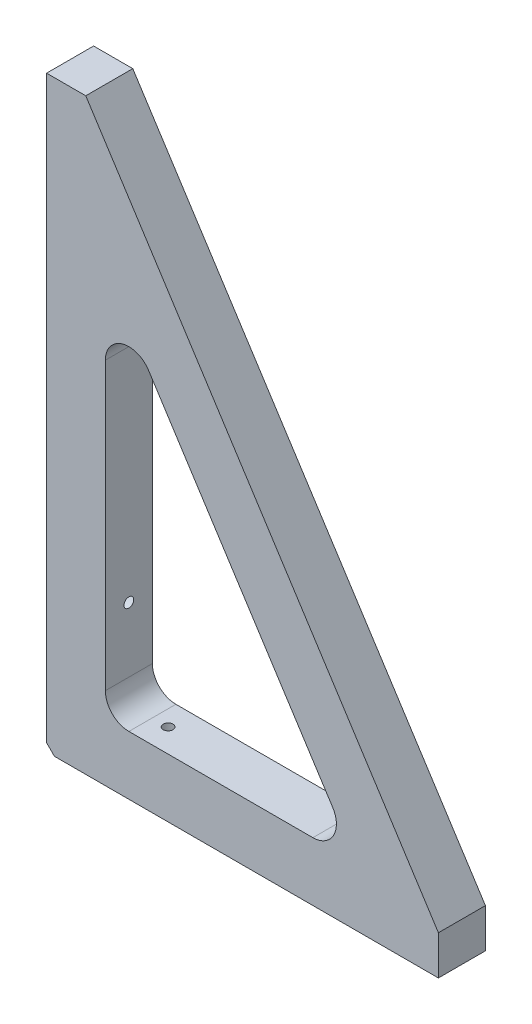
ISO-10303-21;
HEADER;
FILE_DESCRIPTION(('STEP AP214'),'2;1');
FILE_NAME('part.step','',(''),(''),'','','');
FILE_SCHEMA(('AUTOMOTIVE_DESIGN { 1 0 10303 214 1 1 1 1 }'));
ENDSEC;
DATA;
#1=APPLICATION_CONTEXT('core data for automotive mechanical design processes');
#2=APPLICATION_PROTOCOL_DEFINITION('international standard','automotive_design',2000,#1);
#3=PRODUCT_CONTEXT('',#1,'mechanical');
#4=PRODUCT('Part','Part','',(#3));
#5=PRODUCT_RELATED_PRODUCT_CATEGORY('part','',(#4));
#6=PRODUCT_DEFINITION_FORMATION('','',#4);
#7=PRODUCT_DEFINITION_CONTEXT('part definition',#1,'design');
#8=PRODUCT_DEFINITION('design','',#6,#7);
#9=PRODUCT_DEFINITION_SHAPE('','',#8);
#10=(LENGTH_UNIT() NAMED_UNIT(*) SI_UNIT(.MILLI.,.METRE.));
#11=(NAMED_UNIT(*) PLANE_ANGLE_UNIT() SI_UNIT($,.RADIAN.));
#12=(NAMED_UNIT(*) SI_UNIT($,.STERADIAN.) SOLID_ANGLE_UNIT());
#13=UNCERTAINTY_MEASURE_WITH_UNIT(LENGTH_MEASURE(1.E-05),#10,'distance_accuracy_value','');
#14=(GEOMETRIC_REPRESENTATION_CONTEXT(3) GLOBAL_UNCERTAINTY_ASSIGNED_CONTEXT((#13)) GLOBAL_UNIT_ASSIGNED_CONTEXT((#10,
#11,#12)) REPRESENTATION_CONTEXT('',''));
#15=CARTESIAN_POINT('',(0.,0.,0.));
#16=DIRECTION('',(0.,0.,1.));
#17=DIRECTION('',(1.,0.,0.));
#18=AXIS2_PLACEMENT_3D('',#15,#16,#17);
#19=CARTESIAN_POINT('',(13.8000000000034,112.5,0.));
#20=DIRECTION('',(-1.,0.,0.));
#21=DIRECTION('',(0.,0.,1.));
#22=AXIS2_PLACEMENT_3D('',#19,#20,#21);
#23=CONICAL_SURFACE('',#22,3.3235000000218,1.0471975511963);
#24=CARTESIAN_POINT('',(13.8,112.5,0.));
#25=DIRECTION('',(-1.,0.,0.));
#26=DIRECTION('',(0.,0.,1.));
#27=AXIS2_PLACEMENT_3D('',#24,#25,#26);
#28=CIRCLE('',#27,3.32349999999999);
#29=CARTESIAN_POINT('',(13.8,112.5,3.32349999999999));
#30=VERTEX_POINT('',#29);
#31=EDGE_CURVE('E215',#30,#30,#28,.T.);
#32=ORIENTED_EDGE('',*,*,#31,.T.);
#33=EDGE_LOOP('',(#32));
#34=FACE_BOUND('',#33,.T.);
#35=CARTESIAN_POINT('',(15.7188236196362,112.5,0.));
#36=VERTEX_POINT('',#35);
#37=VERTEX_LOOP('',#36);
#38=FACE_BOUND('',#37,.T.);
#39=ADVANCED_FACE('F17',(#34,#38),#23,.F.);
#40=CARTESIAN_POINT('',(75.,13.8000000000034,0.));
#41=DIRECTION('',(0.,-1.,0.));
#42=DIRECTION('',(0.,0.,-1.));
#43=AXIS2_PLACEMENT_3D('',#40,#41,#42);
#44=CONICAL_SURFACE('',#43,3.3235000000218,1.0471975511963);
#45=CARTESIAN_POINT('',(75.,13.7999999999992,0.));
#46=DIRECTION('',(0.,1.,0.));
#47=DIRECTION('',(0.,0.,1.));
#48=AXIS2_PLACEMENT_3D('',#45,#46,#47);
#49=CIRCLE('',#48,3.32350000000001);
#50=CARTESIAN_POINT('',(75.,13.7999999999992,3.32350000000001));
#51=VERTEX_POINT('',#50);
#52=EDGE_CURVE('E233',#51,#51,#49,.F.);
#53=ORIENTED_EDGE('',*,*,#52,.T.);
#54=EDGE_LOOP('',(#53));
#55=FACE_BOUND('',#54,.T.);
#56=CARTESIAN_POINT('',(75.,15.7188236196362,0.));
#57=VERTEX_POINT('',#56);
#58=VERTEX_LOOP('',#57);
#59=FACE_BOUND('',#58,.T.);
#60=ADVANCED_FACE('F108',(#55,#59),#44,.F.);
#61=CARTESIAN_POINT('',(15.7188236196517,112.5,0.));
#62=DIRECTION('',(-1.,0.,0.));
#63=DIRECTION('',(0.,0.,1.));
#64=AXIS2_PLACEMENT_3D('',#61,#62,#63);
#65=CYLINDRICAL_SURFACE('',#64,3.32349999999999);
#66=ORIENTED_EDGE('',*,*,#31,.F.);
#67=EDGE_LOOP('',(#66));
#68=FACE_BOUND('',#67,.T.);
#69=CARTESIAN_POINT('',(0.676499999997304,112.5,0.));
#70=DIRECTION('',(-1.,0.,0.));
#71=DIRECTION('',(0.,0.,1.));
#72=AXIS2_PLACEMENT_3D('',#69,#70,#71);
#73=CIRCLE('',#72,3.3235000000218);
#74=CARTESIAN_POINT('',(0.676499999997304,112.5,3.3235000000218));
#75=VERTEX_POINT('',#74);
#76=EDGE_CURVE('E218',#75,#75,#73,.T.);
#77=ORIENTED_EDGE('',*,*,#76,.T.);
#78=EDGE_LOOP('',(#77));
#79=FACE_BOUND('',#78,.T.);
#80=ADVANCED_FACE('F113',(#68,#79),#65,.F.);
#81=CARTESIAN_POINT('',(75.,0.,0.));
#82=DIRECTION('',(0.,1.,0.));
#83=DIRECTION('',(0.,0.,1.));
#84=AXIS2_PLACEMENT_3D('',#81,#82,#83);
#85=CYLINDRICAL_SURFACE('',#84,3.32350000000001);
#86=ORIENTED_EDGE('',*,*,#52,.F.);
#87=EDGE_LOOP('',(#86));
#88=FACE_BOUND('',#87,.T.);
#89=CARTESIAN_POINT('',(75.,0.676499999940461,0.));
#90=DIRECTION('',(0.,-1.,0.));
#91=DIRECTION('',(0.,0.,-1.));
#92=AXIS2_PLACEMENT_3D('',#89,#90,#91);
#93=CIRCLE('',#92,3.3235000000218);
#94=CARTESIAN_POINT('',(75.,0.676499999940461,-3.3235000000218));
#95=VERTEX_POINT('',#94);
#96=EDGE_CURVE('E229',#95,#95,#93,.T.);
#97=ORIENTED_EDGE('',*,*,#96,.T.);
#98=EDGE_LOOP('',(#97));
#99=FACE_BOUND('',#98,.T.);
#100=ADVANCED_FACE('F205',(#88,#99),#85,.F.);
#101=CARTESIAN_POINT('',(25.,0.,0.));
#102=DIRECTION('',(0.,1.,0.));
#103=DIRECTION('',(0.,0.,1.));
#104=AXIS2_PLACEMENT_3D('',#101,#102,#103);
#105=CYLINDRICAL_SURFACE('',#104,3.3235);
#106=CARTESIAN_POINT('',(25.,0.676499999997304,0.));
#107=DIRECTION('',(0.,-1.,0.));
#108=DIRECTION('',(0.,0.,-1.));
#109=AXIS2_PLACEMENT_3D('',#106,#107,#108);
#110=CIRCLE('',#109,3.3235000000218);
#111=CARTESIAN_POINT('',(25.,0.676499999997304,-3.3235000000218));
#112=VERTEX_POINT('',#111);
#113=EDGE_CURVE('E221',#112,#112,#110,.T.);
#114=ORIENTED_EDGE('',*,*,#113,.T.);
#115=EDGE_LOOP('',(#114));
#116=FACE_BOUND('',#115,.T.);
#117=CARTESIAN_POINT('',(25.,13.8000000000034,0.));
#118=DIRECTION('',(0.,-1.,0.));
#119=DIRECTION('',(0.,0.,-1.));
#120=AXIS2_PLACEMENT_3D('',#117,#118,#119);
#121=CIRCLE('',#120,3.3235000000218);
#122=CARTESIAN_POINT('',(25.,13.8000000000034,-3.3235000000218));
#123=VERTEX_POINT('',#122);
#124=EDGE_CURVE('E308',#123,#123,#121,.F.);
#125=ORIENTED_EDGE('',*,*,#124,.T.);
#126=EDGE_LOOP('',(#125));
#127=FACE_BOUND('',#126,.T.);
#128=ADVANCED_FACE('F201',(#116,#127),#105,.F.);
#129=CARTESIAN_POINT('',(15.7188236196517,37.5,0.));
#130=DIRECTION('',(-1.,0.,0.));
#131=DIRECTION('',(0.,0.,1.));
#132=AXIS2_PLACEMENT_3D('',#129,#130,#131);
#133=CYLINDRICAL_SURFACE('',#132,3.32350000000001);
#134=CARTESIAN_POINT('',(0.676499999940461,37.5,0.));
#135=DIRECTION('',(-1.,0.,0.));
#136=DIRECTION('',(0.,0.,1.));
#137=AXIS2_PLACEMENT_3D('',#134,#135,#136);
#138=CIRCLE('',#137,3.3235000000218);
#139=CARTESIAN_POINT('',(0.676499999940461,37.5,3.3235000000218));
#140=VERTEX_POINT('',#139);
#141=EDGE_CURVE('E222',#140,#140,#138,.T.);
#142=ORIENTED_EDGE('',*,*,#141,.T.);
#143=EDGE_LOOP('',(#142));
#144=FACE_BOUND('',#143,.T.);
#145=CARTESIAN_POINT('',(13.8000000000034,37.5,0.));
#146=DIRECTION('',(-1.,0.,0.));
#147=DIRECTION('',(0.,0.,1.));
#148=AXIS2_PLACEMENT_3D('',#145,#146,#147);
#149=CIRCLE('',#148,3.3235000000218);
#150=CARTESIAN_POINT('',(13.8000000000034,37.5,3.3235000000218));
#151=VERTEX_POINT('',#150);
#152=EDGE_CURVE('E300',#151,#151,#149,.F.);
#153=ORIENTED_EDGE('',*,*,#152,.T.);
#154=EDGE_LOOP('',(#153));
#155=FACE_BOUND('',#154,.T.);
#156=ADVANCED_FACE('F197',(#144,#155),#133,.F.);
#157=CARTESIAN_POINT('',(0.,37.5,0.));
#158=DIRECTION('',(-1.,0.,0.));
#159=DIRECTION('',(0.,0.,1.));
#160=AXIS2_PLACEMENT_3D('',#157,#158,#159);
#161=CONICAL_SURFACE('',#160,3.99999999996226,0.785398163397448);
#162=ORIENTED_EDGE('',*,*,#141,.F.);
#163=EDGE_LOOP('',(#162));
#164=FACE_BOUND('',#163,.T.);
#165=CARTESIAN_POINT('',(0.,37.5,0.));
#166=DIRECTION('',(-1.,0.,0.));
#167=DIRECTION('',(0.,0.,1.));
#168=AXIS2_PLACEMENT_3D('',#165,#166,#167);
#169=CIRCLE('',#168,3.99999999996226);
#170=CARTESIAN_POINT('',(0.,37.5,3.99999999996226));
#171=VERTEX_POINT('',#170);
#172=EDGE_CURVE('E20',#171,#171,#169,.T.);
#173=ORIENTED_EDGE('',*,*,#172,.T.);
#174=EDGE_LOOP('',(#173));
#175=FACE_BOUND('',#174,.T.);
#176=ADVANCED_FACE('F193',(#164,#175),#161,.F.);
#177=CARTESIAN_POINT('',(0.,112.5,0.));
#178=DIRECTION('',(-1.,0.,0.));
#179=DIRECTION('',(0.,0.,1.));
#180=AXIS2_PLACEMENT_3D('',#177,#178,#179);
#181=CONICAL_SURFACE('',#180,3.99999999996226,0.785398163355435);
#182=CARTESIAN_POINT('',(0.,112.5,0.));
#183=DIRECTION('',(-1.,0.,0.));
#184=DIRECTION('',(0.,0.,1.));
#185=AXIS2_PLACEMENT_3D('',#182,#183,#184);
#186=CIRCLE('',#185,3.99999999996226);
#187=CARTESIAN_POINT('',(0.,112.5,3.99999999996226));
#188=VERTEX_POINT('',#187);
#189=EDGE_CURVE('E285',#188,#188,#186,.T.);
#190=ORIENTED_EDGE('',*,*,#189,.T.);
#191=EDGE_LOOP('',(#190));
#192=FACE_BOUND('',#191,.T.);
#193=ORIENTED_EDGE('',*,*,#76,.F.);
#194=EDGE_LOOP('',(#193));
#195=FACE_BOUND('',#194,.T.);
#196=ADVANCED_FACE('F189',(#192,#195),#181,.F.);
#197=CARTESIAN_POINT('',(25.,-5.6843418860808E-11,0.));
#198=DIRECTION('',(0.,-1.,0.));
#199=DIRECTION('',(0.,0.,-1.));
#200=AXIS2_PLACEMENT_3D('',#197,#198,#199);
#201=CONICAL_SURFACE('',#200,4.00000000007594,0.785398163397448);
#202=ORIENTED_EDGE('',*,*,#113,.F.);
#203=EDGE_LOOP('',(#202));
#204=FACE_BOUND('',#203,.T.);
#205=CARTESIAN_POINT('',(25.,0.,0.));
#206=DIRECTION('',(0.,-1.,0.));
#207=DIRECTION('',(0.,0.,-1.));
#208=AXIS2_PLACEMENT_3D('',#205,#206,#207);
#209=CIRCLE('',#208,4.0000000000191);
#210=CARTESIAN_POINT('',(25.,0.,-4.0000000000191));
#211=VERTEX_POINT('',#210);
#212=EDGE_CURVE('E281',#211,#211,#209,.T.);
#213=ORIENTED_EDGE('',*,*,#212,.T.);
#214=EDGE_LOOP('',(#213));
#215=FACE_BOUND('',#214,.T.);
#216=ADVANCED_FACE('F185',(#204,#215),#201,.F.);
#217=CARTESIAN_POINT('',(75.,1.70530256582424E-10,0.));
#218=DIRECTION('',(0.,-1.,0.));
#219=DIRECTION('',(0.,0.,-1.));
#220=AXIS2_PLACEMENT_3D('',#217,#218,#219);
#221=CONICAL_SURFACE('',#220,3.99999999984857,0.785398163439461);
#222=CARTESIAN_POINT('',(75.,5.68434188703607E-11,0.));
#223=DIRECTION('',(0.,-1.,0.));
#224=DIRECTION('',(0.,0.,-1.));
#225=AXIS2_PLACEMENT_3D('',#222,#223,#224);
#226=CIRCLE('',#225,3.99999999996226);
#227=CARTESIAN_POINT('',(75.,5.68434188703607E-11,-3.99999999996226));
#228=VERTEX_POINT('',#227);
#229=EDGE_CURVE('E276',#228,#228,#226,.T.);
#230=ORIENTED_EDGE('',*,*,#229,.T.);
#231=EDGE_LOOP('',(#230));
#232=FACE_BOUND('',#231,.T.);
#233=ORIENTED_EDGE('',*,*,#96,.F.);
#234=EDGE_LOOP('',(#233));
#235=FACE_BOUND('',#234,.T.);
#236=ADVANCED_FACE('F181',(#232,#235),#221,.F.);
#237=CARTESIAN_POINT('',(25.,13.8000000001171,0.));
#238=DIRECTION('',(0.,-1.,0.));
#239=DIRECTION('',(0.,0.,-1.));
#240=AXIS2_PLACEMENT_3D('',#237,#238,#239);
#241=CONICAL_SURFACE('',#240,3.32349999985126,1.04719755120402);
#242=ORIENTED_EDGE('',*,*,#124,.F.);
#243=EDGE_LOOP('',(#242));
#244=FACE_BOUND('',#243,.T.);
#245=CARTESIAN_POINT('',(25.,15.0000000000256,0.));
#246=DIRECTION('',(0.,-1.,0.));
#247=DIRECTION('',(0.,0.,-1.));
#248=AXIS2_PLACEMENT_3D('',#245,#246,#247);
#249=CIRCLE('',#248,1.24503903089135);
#250=CARTESIAN_POINT('',(25.,15.0000000000256,-1.24503903089135));
#251=VERTEX_POINT('',#250);
#252=EDGE_CURVE('E266',#251,#251,#249,.T.);
#253=ORIENTED_EDGE('',*,*,#252,.F.);
#254=EDGE_LOOP('',(#253));
#255=FACE_BOUND('',#254,.T.);
#256=ADVANCED_FACE('F177',(#244,#255),#241,.F.);
#257=CARTESIAN_POINT('',(13.8000000000034,37.5,0.));
#258=DIRECTION('',(-1.,0.,0.));
#259=DIRECTION('',(0.,0.,1.));
#260=AXIS2_PLACEMENT_3D('',#257,#258,#259);
#261=CONICAL_SURFACE('',#260,3.3235000000218,1.04719755120085);
#262=ORIENTED_EDGE('',*,*,#152,.F.);
#263=EDGE_LOOP('',(#262));
#264=FACE_BOUND('',#263,.T.);
#265=CARTESIAN_POINT('',(14.9999999999864,37.5,0.));
#266=DIRECTION('',(-1.,0.,0.));
#267=DIRECTION('',(0.,0.,1.));
#268=AXIS2_PLACEMENT_3D('',#265,#266,#267);
#269=CIRCLE('',#268,1.24503903094819);
#270=CARTESIAN_POINT('',(14.9999999999864,37.5,1.24503903094819));
#271=VERTEX_POINT('',#270);
#272=EDGE_CURVE('E255',#271,#271,#269,.T.);
#273=ORIENTED_EDGE('',*,*,#272,.F.);
#274=EDGE_LOOP('',(#273));
#275=FACE_BOUND('',#274,.T.);
#276=ADVANCED_FACE('F174',(#264,#275),#261,.F.);
#277=CARTESIAN_POINT('',(0.,0.,6.));
#278=DIRECTION('',(0.,0.,1.));
#279=DIRECTION('',(1.,0.,0.));
#280=AXIS2_PLACEMENT_3D('',#277,#278,#279);
#281=PLANE('',#280);
#282=CARTESIAN_POINT('',(21.,21.,6.));
#283=DIRECTION('',(0.,0.,1.));
#284=DIRECTION('',(1.,0.,0.));
#285=AXIS2_PLACEMENT_3D('',#282,#283,#284);
#286=CIRCLE('',#285,6.);
#287=CARTESIAN_POINT('',(21.,15.,6.));
#288=VERTEX_POINT('',#287);
#289=CARTESIAN_POINT('',(15.,21.,6.));
#290=VERTEX_POINT('',#289);
#291=EDGE_CURVE('E260',#288,#290,#286,.F.);
#292=ORIENTED_EDGE('',*,*,#291,.T.);
#293=DIRECTION('',(0.,1.,0.));
#294=VECTOR('',#293,1.);
#295=CARTESIAN_POINT('',(15.,94.0544826090047,6.));
#296=LINE('',#295,#294);
#297=CARTESIAN_POINT('',(15.,94.0544826090047,6.));
#298=VERTEX_POINT('',#297);
#299=EDGE_CURVE('E264',#298,#290,#296,.F.);
#300=ORIENTED_EDGE('',*,*,#299,.F.);
#301=CARTESIAN_POINT('',(21.,94.0544826090047,6.));
#302=DIRECTION('',(0.,0.,1.));
#303=DIRECTION('',(1.,0.,0.));
#304=AXIS2_PLACEMENT_3D('',#301,#302,#303);
#305=CIRCLE('',#304,6.);
#306=CARTESIAN_POINT('',(26.0470708522593,97.2990281568857,6.));
#307=VERTEX_POINT('',#306);
#308=EDGE_CURVE('E252',#298,#307,#305,.F.);
#309=ORIENTED_EDGE('',*,*,#308,.T.);
#310=DIRECTION('',(0.540757591313499,-0.841178475376554,0.));
#311=VECTOR('',#310,1.);
#312=CARTESIAN_POINT('',(73.0106668151909,24.244545547881,6.));
#313=LINE('',#312,#311);
#314=CARTESIAN_POINT('',(73.0106668151909,24.244545547881,6.));
#315=VERTEX_POINT('',#314);
#316=EDGE_CURVE('E74',#315,#307,#313,.F.);
#317=ORIENTED_EDGE('',*,*,#316,.F.);
#318=CARTESIAN_POINT('',(67.9635959629316,21.,6.));
#319=DIRECTION('',(0.,0.,1.));
#320=DIRECTION('',(1.,0.,0.));
#321=AXIS2_PLACEMENT_3D('',#318,#319,#320);
#322=CIRCLE('',#321,6.);
#323=CARTESIAN_POINT('',(67.9635959629316,15.,6.));
#324=VERTEX_POINT('',#323);
#325=EDGE_CURVE('E271',#315,#324,#322,.F.);
#326=ORIENTED_EDGE('',*,*,#325,.T.);
#327=DIRECTION('',(1.,0.,0.));
#328=VECTOR('',#327,1.);
#329=CARTESIAN_POINT('',(21.,15.,6.));
#330=LINE('',#329,#328);
#331=EDGE_CURVE('E274',#288,#324,#330,.T.);
#332=ORIENTED_EDGE('',*,*,#331,.F.);
#333=EDGE_LOOP('',(#292,#300,#309,#317,#326,#332));
#334=FACE_BOUND('',#333,.T.);
#335=DIRECTION('',(0.,1.,0.));
#336=VECTOR('',#335,1.);
#337=CARTESIAN_POINT('',(100.,0.,6.));
#338=LINE('',#337,#336);
#339=CARTESIAN_POINT('',(100.,0.,6.));
#340=VERTEX_POINT('',#339);
#341=CARTESIAN_POINT('',(100.,10.,6.));
#342=VERTEX_POINT('',#341);
#343=EDGE_CURVE('E386',#340,#342,#338,.T.);
#344=ORIENTED_EDGE('',*,*,#343,.T.);
#345=DIRECTION('',(0.540757591313499,-0.841178475376554,0.));
#346=VECTOR('',#345,1.);
#347=CARTESIAN_POINT('',(100.,10.,6.));
#348=LINE('',#347,#346);
#349=CARTESIAN_POINT('',(9.99999999999998,150.,6.));
#350=VERTEX_POINT('',#349);
#351=EDGE_CURVE('E379',#342,#350,#348,.F.);
#352=ORIENTED_EDGE('',*,*,#351,.T.);
#353=DIRECTION('',(1.,0.,0.));
#354=VECTOR('',#353,1.);
#355=CARTESIAN_POINT('',(10.,150.,6.));
#356=LINE('',#355,#354);
#357=CARTESIAN_POINT('',(0.,150.,6.));
#358=VERTEX_POINT('',#357);
#359=EDGE_CURVE('E373',#350,#358,#356,.F.);
#360=ORIENTED_EDGE('',*,*,#359,.T.);
#361=DIRECTION('',(0.,1.,0.));
#362=VECTOR('',#361,1.);
#363=CARTESIAN_POINT('',(0.,150.,6.));
#364=LINE('',#363,#362);
#365=CARTESIAN_POINT('',(0.,2.,6.));
#366=VERTEX_POINT('',#365);
#367=EDGE_CURVE('E84',#358,#366,#364,.F.);
#368=ORIENTED_EDGE('',*,*,#367,.T.);
#369=DIRECTION('',(-0.707106781186548,0.707106781186548,0.));
#370=VECTOR('',#369,1.);
#371=CARTESIAN_POINT('',(0.,2.,6.));
#372=LINE('',#371,#370);
#373=CARTESIAN_POINT('',(2.,0.,6.));
#374=VERTEX_POINT('',#373);
#375=EDGE_CURVE('E292',#366,#374,#372,.F.);
#376=ORIENTED_EDGE('',*,*,#375,.T.);
#377=DIRECTION('',(1.,0.,0.));
#378=VECTOR('',#377,1.);
#379=CARTESIAN_POINT('',(2.,0.,6.));
#380=LINE('',#379,#378);
#381=EDGE_CURVE('E284',#374,#340,#380,.T.);
#382=ORIENTED_EDGE('',*,*,#381,.T.);
#383=EDGE_LOOP('',(#344,#352,#360,#368,#376,#382));
#384=FACE_BOUND('',#383,.T.);
#385=ADVANCED_FACE('F170',(#334,#384),#281,.T.);
#386=CARTESIAN_POINT('',(0.,150.,6.));
#387=DIRECTION('',(1.,0.,0.));
#388=DIRECTION('',(0.,0.,-1.));
#389=AXIS2_PLACEMENT_3D('',#386,#387,#388);
#390=PLANE('',#389);
#391=ORIENTED_EDGE('',*,*,#189,.F.);
#392=EDGE_LOOP('',(#391));
#393=FACE_BOUND('',#392,.T.);
#394=ORIENTED_EDGE('',*,*,#172,.F.);
#395=EDGE_LOOP('',(#394));
#396=FACE_BOUND('',#395,.T.);
#397=DIRECTION('',(0.,0.,1.));
#398=VECTOR('',#397,1.);
#399=CARTESIAN_POINT('',(0.,2.,6.));
#400=LINE('',#399,#398);
#401=CARTESIAN_POINT('',(0.,2.,-6.));
#402=VERTEX_POINT('',#401);
#403=EDGE_CURVE('E288',#402,#366,#400,.T.);
#404=ORIENTED_EDGE('',*,*,#403,.T.);
#405=ORIENTED_EDGE('',*,*,#367,.F.);
#406=DIRECTION('',(0.,0.,-1.));
#407=VECTOR('',#406,1.);
#408=CARTESIAN_POINT('',(0.,150.,6.));
#409=LINE('',#408,#407);
#410=CARTESIAN_POINT('',(0.,150.,-6.));
#411=VERTEX_POINT('',#410);
#412=EDGE_CURVE('E313',#358,#411,#409,.T.);
#413=ORIENTED_EDGE('',*,*,#412,.T.);
#414=DIRECTION('',(0.,1.,0.));
#415=VECTOR('',#414,1.);
#416=CARTESIAN_POINT('',(0.,0.,-6.));
#417=LINE('',#416,#415);
#418=EDGE_CURVE('E356',#411,#402,#417,.F.);
#419=ORIENTED_EDGE('',*,*,#418,.T.);
#420=EDGE_LOOP('',(#404,#405,#413,#419));
#421=FACE_BOUND('',#420,.T.);
#422=ADVANCED_FACE('F166',(#393,#396,#421),#390,.F.);
#423=CARTESIAN_POINT('',(0.,2.,6.));
#424=DIRECTION('',(0.707106781186548,0.707106781186548,0.));
#425=DIRECTION('',(-0.707106781186548,0.707106781186548,0.));
#426=AXIS2_PLACEMENT_3D('',#423,#424,#425);
#427=PLANE('',#426);
#428=DIRECTION('',(0.,0.,1.));
#429=VECTOR('',#428,1.);
#430=CARTESIAN_POINT('',(2.,0.,6.));
#431=LINE('',#430,#429);
#432=CARTESIAN_POINT('',(2.,0.,-6.));
#433=VERTEX_POINT('',#432);
#434=EDGE_CURVE('E335',#433,#374,#431,.T.);
#435=ORIENTED_EDGE('',*,*,#434,.T.);
#436=ORIENTED_EDGE('',*,*,#375,.F.);
#437=ORIENTED_EDGE('',*,*,#403,.F.);
#438=DIRECTION('',(0.707106781186548,-0.707106781186548,0.));
#439=VECTOR('',#438,1.);
#440=CARTESIAN_POINT('',(0.,2.,-6.));
#441=LINE('',#440,#439);
#442=EDGE_CURVE('E352',#402,#433,#441,.T.);
#443=ORIENTED_EDGE('',*,*,#442,.T.);
#444=EDGE_LOOP('',(#435,#436,#437,#443));
#445=FACE_BOUND('',#444,.T.);
#446=ADVANCED_FACE('F162',(#445),#427,.F.);
#447=CARTESIAN_POINT('',(2.,0.,6.));
#448=DIRECTION('',(0.,1.,0.));
#449=DIRECTION('',(0.,0.,1.));
#450=AXIS2_PLACEMENT_3D('',#447,#448,#449);
#451=PLANE('',#450);
#452=ORIENTED_EDGE('',*,*,#229,.F.);
#453=EDGE_LOOP('',(#452));
#454=FACE_BOUND('',#453,.T.);
#455=ORIENTED_EDGE('',*,*,#212,.F.);
#456=EDGE_LOOP('',(#455));
#457=FACE_BOUND('',#456,.T.);
#458=DIRECTION('',(0.,0.,1.));
#459=VECTOR('',#458,1.);
#460=CARTESIAN_POINT('',(100.,0.,6.));
#461=LINE('',#460,#459);
#462=CARTESIAN_POINT('',(100.,0.,-6.));
#463=VERTEX_POINT('',#462);
#464=EDGE_CURVE('E280',#463,#340,#461,.T.);
#465=ORIENTED_EDGE('',*,*,#464,.T.);
#466=ORIENTED_EDGE('',*,*,#381,.F.);
#467=ORIENTED_EDGE('',*,*,#434,.F.);
#468=DIRECTION('',(1.,0.,0.));
#469=VECTOR('',#468,1.);
#470=CARTESIAN_POINT('',(0.,0.,-6.));
#471=LINE('',#470,#469);
#472=EDGE_CURVE('E345',#433,#463,#471,.T.);
#473=ORIENTED_EDGE('',*,*,#472,.T.);
#474=EDGE_LOOP('',(#465,#466,#467,#473));
#475=FACE_BOUND('',#474,.T.);
#476=ADVANCED_FACE('F158',(#454,#457,#475),#451,.F.);
#477=CARTESIAN_POINT('',(100.,0.,6.));
#478=DIRECTION('',(-1.,0.,0.));
#479=DIRECTION('',(0.,0.,1.));
#480=AXIS2_PLACEMENT_3D('',#477,#478,#479);
#481=PLANE('',#480);
#482=DIRECTION('',(0.,0.,1.));
#483=VECTOR('',#482,1.);
#484=CARTESIAN_POINT('',(100.,10.,6.));
#485=LINE('',#484,#483);
#486=CARTESIAN_POINT('',(100.,10.,-6.));
#487=VERTEX_POINT('',#486);
#488=EDGE_CURVE('E382',#487,#342,#485,.T.);
#489=ORIENTED_EDGE('',*,*,#488,.T.);
#490=ORIENTED_EDGE('',*,*,#343,.F.);
#491=ORIENTED_EDGE('',*,*,#464,.F.);
#492=DIRECTION('',(0.,1.,0.));
#493=VECTOR('',#492,1.);
#494=CARTESIAN_POINT('',(100.,0.,-6.));
#495=LINE('',#494,#493);
#496=EDGE_CURVE('E338',#463,#487,#495,.T.);
#497=ORIENTED_EDGE('',*,*,#496,.T.);
#498=EDGE_LOOP('',(#489,#490,#491,#497));
#499=FACE_BOUND('',#498,.T.);
#500=ADVANCED_FACE('F154',(#499),#481,.F.);
#501=CARTESIAN_POINT('',(100.,10.,6.));
#502=DIRECTION('',(-0.841178475376554,-0.540757591313499,0.));
#503=DIRECTION('',(0.540757591313499,-0.841178475376554,0.));
#504=AXIS2_PLACEMENT_3D('',#501,#502,#503);
#505=PLANE('',#504);
#506=DIRECTION('',(0.,0.,-1.));
#507=VECTOR('',#506,1.);
#508=CARTESIAN_POINT('',(9.99999999999994,150.,6.));
#509=LINE('',#508,#507);
#510=CARTESIAN_POINT('',(9.99999999999995,150.,-6.));
#511=VERTEX_POINT('',#510);
#512=EDGE_CURVE('E376',#511,#350,#509,.F.);
#513=ORIENTED_EDGE('',*,*,#512,.T.);
#514=ORIENTED_EDGE('',*,*,#351,.F.);
#515=ORIENTED_EDGE('',*,*,#488,.F.);
#516=DIRECTION('',(-0.540757591313499,0.841178475376553,0.));
#517=VECTOR('',#516,1.);
#518=CARTESIAN_POINT('',(100.,10.,-6.));
#519=LINE('',#518,#517);
#520=EDGE_CURVE('E333',#487,#511,#519,.T.);
#521=ORIENTED_EDGE('',*,*,#520,.T.);
#522=EDGE_LOOP('',(#513,#514,#515,#521));
#523=FACE_BOUND('',#522,.T.);
#524=ADVANCED_FACE('F150',(#523),#505,.F.);
#525=CARTESIAN_POINT('',(10.,150.,6.));
#526=DIRECTION('',(0.,-1.,0.));
#527=DIRECTION('',(0.,0.,-1.));
#528=AXIS2_PLACEMENT_3D('',#525,#526,#527);
#529=PLANE('',#528);
#530=ORIENTED_EDGE('',*,*,#412,.F.);
#531=ORIENTED_EDGE('',*,*,#359,.F.);
#532=ORIENTED_EDGE('',*,*,#512,.F.);
#533=DIRECTION('',(1.,0.,0.));
#534=VECTOR('',#533,1.);
#535=CARTESIAN_POINT('',(0.,150.,-6.));
#536=LINE('',#535,#534);
#537=EDGE_CURVE('E330',#511,#411,#536,.F.);
#538=ORIENTED_EDGE('',*,*,#537,.T.);
#539=EDGE_LOOP('',(#530,#531,#532,#538));
#540=FACE_BOUND('',#539,.T.);
#541=ADVANCED_FACE('F146',(#540),#529,.F.);
#542=CARTESIAN_POINT('',(73.0106668151909,24.244545547881,6.));
#543=DIRECTION('',(-0.841178475376554,-0.540757591313499,0.));
#544=DIRECTION('',(0.540757591313499,-0.841178475376554,0.));
#545=AXIS2_PLACEMENT_3D('',#542,#543,#544);
#546=PLANE('',#545);
#547=ORIENTED_EDGE('',*,*,#316,.T.);
#548=DIRECTION('',(0.,0.,1.));
#549=VECTOR('',#548,1.);
#550=CARTESIAN_POINT('',(26.0470708522593,97.2990281568857,6.));
#551=LINE('',#550,#549);
#552=CARTESIAN_POINT('',(26.0470708522593,97.2990281568857,-6.));
#553=VERTEX_POINT('',#552);
#554=EDGE_CURVE('E254',#307,#553,#551,.F.);
#555=ORIENTED_EDGE('',*,*,#554,.T.);
#556=DIRECTION('',(0.540757591313498,-0.841178475376554,0.));
#557=VECTOR('',#556,1.);
#558=CARTESIAN_POINT('',(26.0470708522592,97.2990281568859,-6.));
#559=LINE('',#558,#557);
#560=CARTESIAN_POINT('',(73.0106668151909,24.244545547881,-6.));
#561=VERTEX_POINT('',#560);
#562=EDGE_CURVE('E251',#553,#561,#559,.T.);
#563=ORIENTED_EDGE('',*,*,#562,.T.);
#564=DIRECTION('',(0.,0.,1.));
#565=VECTOR('',#564,1.);
#566=CARTESIAN_POINT('',(73.0106668151909,24.244545547881,6.));
#567=LINE('',#566,#565);
#568=EDGE_CURVE('E275',#561,#315,#567,.T.);
#569=ORIENTED_EDGE('',*,*,#568,.T.);
#570=EDGE_LOOP('',(#547,#555,#563,#569));
#571=FACE_BOUND('',#570,.T.);
#572=ADVANCED_FACE('F142',(#571),#546,.T.);
#573=CARTESIAN_POINT('',(67.9635959629316,21.,6.));
#574=DIRECTION('',(0.,0.,1.));
#575=DIRECTION('',(1.,0.,0.));
#576=AXIS2_PLACEMENT_3D('',#573,#574,#575);
#577=CYLINDRICAL_SURFACE('',#576,6.);
#578=DIRECTION('',(0.,0.,1.));
#579=VECTOR('',#578,1.);
#580=CARTESIAN_POINT('',(67.9635959629316,15.,6.));
#581=LINE('',#580,#579);
#582=CARTESIAN_POINT('',(67.9635959629316,15.,-6.));
#583=VERTEX_POINT('',#582);
#584=EDGE_CURVE('E270',#324,#583,#581,.F.);
#585=ORIENTED_EDGE('',*,*,#584,.F.);
#586=ORIENTED_EDGE('',*,*,#325,.F.);
#587=ORIENTED_EDGE('',*,*,#568,.F.);
#588=CARTESIAN_POINT('',(67.9635959629316,21.,-6.));
#589=DIRECTION('',(0.,0.,1.));
#590=DIRECTION('',(1.,0.,0.));
#591=AXIS2_PLACEMENT_3D('',#588,#589,#590);
#592=CIRCLE('',#591,6.);
#593=EDGE_CURVE('E247',#561,#583,#592,.F.);
#594=ORIENTED_EDGE('',*,*,#593,.T.);
#595=EDGE_LOOP('',(#585,#586,#587,#594));
#596=FACE_BOUND('',#595,.T.);
#597=ADVANCED_FACE('F138',(#596),#577,.F.);
#598=CARTESIAN_POINT('',(21.,15.,6.));
#599=DIRECTION('',(0.,1.,0.));
#600=DIRECTION('',(0.,0.,1.));
#601=AXIS2_PLACEMENT_3D('',#598,#599,#600);
#602=PLANE('',#601);
#603=ORIENTED_EDGE('',*,*,#252,.T.);
#604=EDGE_LOOP('',(#603));
#605=FACE_BOUND('',#604,.T.);
#606=ORIENTED_EDGE('',*,*,#331,.T.);
#607=ORIENTED_EDGE('',*,*,#584,.T.);
#608=DIRECTION('',(1.,0.,0.));
#609=VECTOR('',#608,1.);
#610=CARTESIAN_POINT('',(0.,15.,-6.));
#611=LINE('',#610,#609);
#612=CARTESIAN_POINT('',(21.,15.,-6.));
#613=VERTEX_POINT('',#612);
#614=EDGE_CURVE('E246',#583,#613,#611,.F.);
#615=ORIENTED_EDGE('',*,*,#614,.T.);
#616=DIRECTION('',(0.,0.,1.));
#617=VECTOR('',#616,1.);
#618=CARTESIAN_POINT('',(21.,15.,6.));
#619=LINE('',#618,#617);
#620=EDGE_CURVE('E265',#613,#288,#619,.T.);
#621=ORIENTED_EDGE('',*,*,#620,.T.);
#622=EDGE_LOOP('',(#606,#607,#615,#621));
#623=FACE_BOUND('',#622,.T.);
#624=ADVANCED_FACE('F134',(#605,#623),#602,.T.);
#625=CARTESIAN_POINT('',(21.,21.,6.));
#626=DIRECTION('',(0.,0.,1.));
#627=DIRECTION('',(1.,0.,0.));
#628=AXIS2_PLACEMENT_3D('',#625,#626,#627);
#629=CYLINDRICAL_SURFACE('',#628,6.);
#630=DIRECTION('',(0.,0.,-1.));
#631=VECTOR('',#630,1.);
#632=CARTESIAN_POINT('',(15.,21.,6.));
#633=LINE('',#632,#631);
#634=CARTESIAN_POINT('',(15.,21.,-6.));
#635=VERTEX_POINT('',#634);
#636=EDGE_CURVE('E259',#290,#635,#633,.T.);
#637=ORIENTED_EDGE('',*,*,#636,.F.);
#638=ORIENTED_EDGE('',*,*,#291,.F.);
#639=ORIENTED_EDGE('',*,*,#620,.F.);
#640=CARTESIAN_POINT('',(21.,21.,-6.));
#641=DIRECTION('',(0.,0.,1.));
#642=DIRECTION('',(1.,0.,0.));
#643=AXIS2_PLACEMENT_3D('',#640,#641,#642);
#644=CIRCLE('',#643,6.);
#645=EDGE_CURVE('E242',#613,#635,#644,.F.);
#646=ORIENTED_EDGE('',*,*,#645,.T.);
#647=EDGE_LOOP('',(#637,#638,#639,#646));
#648=FACE_BOUND('',#647,.T.);
#649=ADVANCED_FACE('F130',(#648),#629,.F.);
#650=CARTESIAN_POINT('',(15.,94.0544826090047,6.));
#651=DIRECTION('',(1.,0.,0.));
#652=DIRECTION('',(0.,0.,-1.));
#653=AXIS2_PLACEMENT_3D('',#650,#651,#652);
#654=PLANE('',#653);
#655=ORIENTED_EDGE('',*,*,#272,.T.);
#656=EDGE_LOOP('',(#655));
#657=FACE_BOUND('',#656,.T.);
#658=ORIENTED_EDGE('',*,*,#299,.T.);
#659=ORIENTED_EDGE('',*,*,#636,.T.);
#660=DIRECTION('',(0.,1.,0.));
#661=VECTOR('',#660,1.);
#662=CARTESIAN_POINT('',(15.,0.,-6.));
#663=LINE('',#662,#661);
#664=CARTESIAN_POINT('',(15.,94.0544826090047,-6.));
#665=VERTEX_POINT('',#664);
#666=EDGE_CURVE('E27',#635,#665,#663,.T.);
#667=ORIENTED_EDGE('',*,*,#666,.T.);
#668=DIRECTION('',(0.,0.,1.));
#669=VECTOR('',#668,1.);
#670=CARTESIAN_POINT('',(15.,94.0544826090047,6.));
#671=LINE('',#670,#669);
#672=EDGE_CURVE('E35',#665,#298,#671,.T.);
#673=ORIENTED_EDGE('',*,*,#672,.T.);
#674=EDGE_LOOP('',(#658,#659,#667,#673));
#675=FACE_BOUND('',#674,.T.);
#676=ADVANCED_FACE('F123',(#657,#675),#654,.T.);
#677=CARTESIAN_POINT('',(21.,94.0544826090047,6.));
#678=DIRECTION('',(0.,0.,1.));
#679=DIRECTION('',(1.,0.,0.));
#680=AXIS2_PLACEMENT_3D('',#677,#678,#679);
#681=CYLINDRICAL_SURFACE('',#680,6.);
#682=ORIENTED_EDGE('',*,*,#554,.F.);
#683=ORIENTED_EDGE('',*,*,#308,.F.);
#684=ORIENTED_EDGE('',*,*,#672,.F.);
#685=CARTESIAN_POINT('',(21.,94.0544826090047,-6.));
#686=DIRECTION('',(0.,0.,1.));
#687=DIRECTION('',(1.,0.,0.));
#688=AXIS2_PLACEMENT_3D('',#685,#686,#687);
#689=CIRCLE('',#688,6.);
#690=EDGE_CURVE('E11',#665,#553,#689,.F.);
#691=ORIENTED_EDGE('',*,*,#690,.T.);
#692=EDGE_LOOP('',(#682,#683,#684,#691));
#693=FACE_BOUND('',#692,.T.);
#694=ADVANCED_FACE('F118',(#693),#681,.F.);
#695=CARTESIAN_POINT('',(0.,0.,-6.));
#696=DIRECTION('',(0.,0.,1.));
#697=DIRECTION('',(1.,0.,0.));
#698=AXIS2_PLACEMENT_3D('',#695,#696,#697);
#699=PLANE('',#698);
#700=ORIENTED_EDGE('',*,*,#666,.F.);
#701=ORIENTED_EDGE('',*,*,#645,.F.);
#702=ORIENTED_EDGE('',*,*,#614,.F.);
#703=ORIENTED_EDGE('',*,*,#593,.F.);
#704=ORIENTED_EDGE('',*,*,#562,.F.);
#705=ORIENTED_EDGE('',*,*,#690,.F.);
#706=EDGE_LOOP('',(#700,#701,#702,#703,#704,#705));
#707=FACE_BOUND('',#706,.T.);
#708=ORIENTED_EDGE('',*,*,#520,.F.);
#709=ORIENTED_EDGE('',*,*,#496,.F.);
#710=ORIENTED_EDGE('',*,*,#472,.F.);
#711=ORIENTED_EDGE('',*,*,#442,.F.);
#712=ORIENTED_EDGE('',*,*,#418,.F.);
#713=ORIENTED_EDGE('',*,*,#537,.F.);
#714=EDGE_LOOP('',(#708,#709,#710,#711,#712,#713));
#715=FACE_BOUND('',#714,.T.);
#716=ADVANCED_FACE('F116',(#707,#715),#699,.F.);
#717=CLOSED_SHELL('',(#39,#60,#80,#100,#128,#156,#176,#196,#216,#236,#256,#276,#385,#422,#446,
#476,#500,#524,#541,#572,#597,#624,#649,#676,#694,#716));
#718=MANIFOLD_SOLID_BREP('B1',#717);
#719=ADVANCED_BREP_SHAPE_REPRESENTATION('',(#18,#718),#14);
#720=SHAPE_DEFINITION_REPRESENTATION(#9,#719);
ENDSEC;
END-ISO-10303-21;
